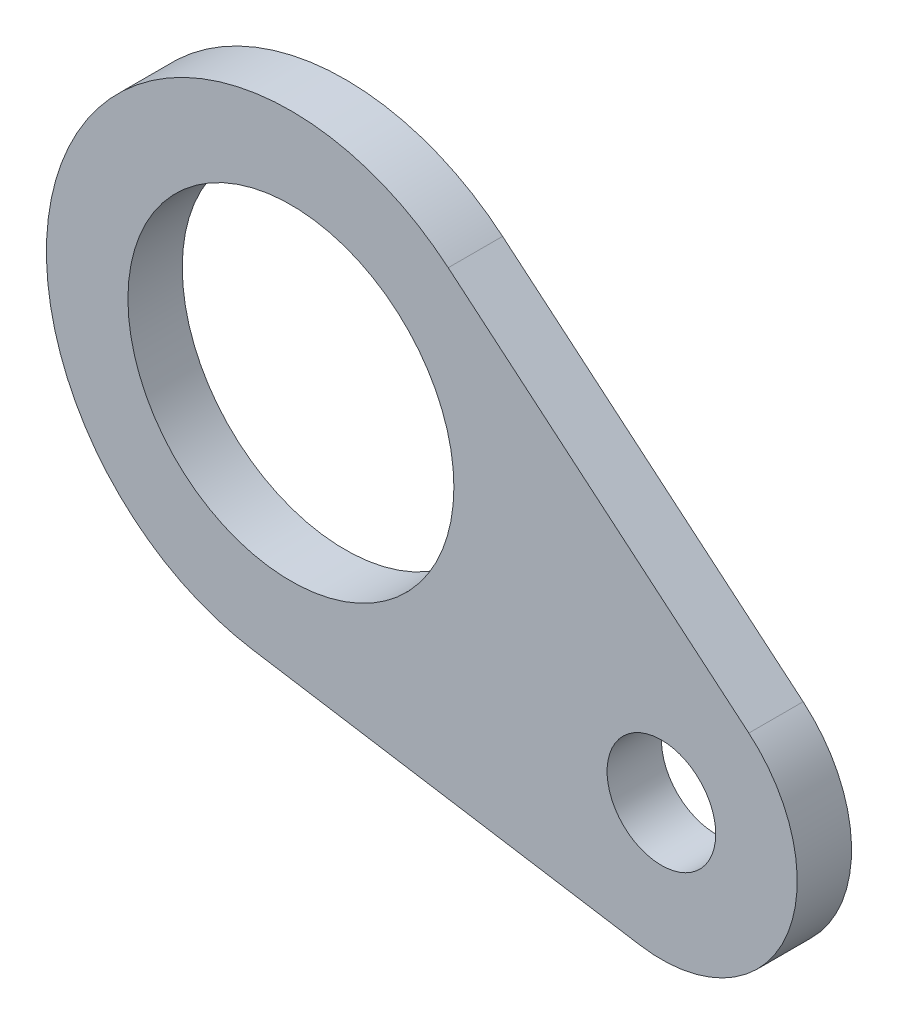
ISO-10303-21;
HEADER;
FILE_DESCRIPTION(('STEP AP214'),'2;1');
FILE_NAME('part.step','',(''),(''),'','','');
FILE_SCHEMA(('AUTOMOTIVE_DESIGN { 1 0 10303 214 1 1 1 1 }'));
ENDSEC;
DATA;
#1=APPLICATION_CONTEXT('core data for automotive mechanical design processes');
#2=APPLICATION_PROTOCOL_DEFINITION('international standard','automotive_design',2000,#1);
#3=PRODUCT_CONTEXT('',#1,'mechanical');
#4=PRODUCT('Part','Part','',(#3));
#5=PRODUCT_RELATED_PRODUCT_CATEGORY('part','',(#4));
#6=PRODUCT_DEFINITION_FORMATION('','',#4);
#7=PRODUCT_DEFINITION_CONTEXT('part definition',#1,'design');
#8=PRODUCT_DEFINITION('design','',#6,#7);
#9=PRODUCT_DEFINITION_SHAPE('','',#8);
#10=(LENGTH_UNIT() NAMED_UNIT(*) SI_UNIT(.MILLI.,.METRE.));
#11=(NAMED_UNIT(*) PLANE_ANGLE_UNIT() SI_UNIT($,.RADIAN.));
#12=(NAMED_UNIT(*) SI_UNIT($,.STERADIAN.) SOLID_ANGLE_UNIT());
#13=UNCERTAINTY_MEASURE_WITH_UNIT(LENGTH_MEASURE(1.E-05),#10,'distance_accuracy_value','');
#14=(GEOMETRIC_REPRESENTATION_CONTEXT(3) GLOBAL_UNCERTAINTY_ASSIGNED_CONTEXT((#13)) GLOBAL_UNIT_ASSIGNED_CONTEXT((#10,
#11,#12)) REPRESENTATION_CONTEXT('',''));
#15=CARTESIAN_POINT('',(0.,0.,0.));
#16=DIRECTION('',(0.,0.,1.));
#17=DIRECTION('',(1.,0.,0.));
#18=AXIS2_PLACEMENT_3D('',#15,#16,#17);
#19=CARTESIAN_POINT('',(-18.1262683767664,-21.5592093047159,1.));
#20=DIRECTION('',(0.643536155388157,0.765415714960328,0.));
#21=DIRECTION('',(-0.765415714960328,0.643536155388157,0.));
#22=AXIS2_PLACEMENT_3D('',#19,#20,#21);
#23=PLANE('',#22);
#24=DIRECTION('',(0.765415714960328,-0.643536155388157,0.));
#25=VECTOR('',#24,1.);
#26=CARTESIAN_POINT('',(-18.1262683767664,-21.5592093047159,0.));
#27=LINE('',#26,#25);
#28=CARTESIAN_POINT('',(-108.494409163824,54.4193272669992,0.));
#29=VERTEX_POINT('',#28);
#30=CARTESIAN_POINT('',(-102.961665850331,49.7675801299554,0.));
#31=VERTEX_POINT('',#30);
#32=EDGE_CURVE('E121',#29,#31,#27,.T.);
#33=ORIENTED_EDGE('',*,*,#32,.F.);
#34=DIRECTION('',(0.,0.,-1.));
#35=VECTOR('',#34,1.);
#36=CARTESIAN_POINT('',(-108.494409163824,54.4193272669992,1.));
#37=LINE('',#36,#35);
#38=CARTESIAN_POINT('',(-108.494409163824,54.4193272669992,1.));
#39=VERTEX_POINT('',#38);
#40=EDGE_CURVE('E11',#39,#29,#37,.T.);
#41=ORIENTED_EDGE('',*,*,#40,.F.);
#42=DIRECTION('',(0.765415714960328,-0.643536155388157,0.));
#43=VECTOR('',#42,1.);
#44=CARTESIAN_POINT('',(-18.1262683767664,-21.5592093047159,1.));
#45=LINE('',#44,#43);
#46=CARTESIAN_POINT('',(-102.961665850331,49.7675801299554,1.));
#47=VERTEX_POINT('',#46);
#48=EDGE_CURVE('E98',#39,#47,#45,.T.);
#49=ORIENTED_EDGE('',*,*,#48,.T.);
#50=DIRECTION('',(0.,0.,-1.));
#51=VECTOR('',#50,1.);
#52=CARTESIAN_POINT('',(-102.961665850331,49.7675801299554,1.));
#53=LINE('',#52,#51);
#54=EDGE_CURVE('E59',#47,#31,#53,.T.);
#55=ORIENTED_EDGE('',*,*,#54,.T.);
#56=EDGE_LOOP('',(#33,#41,#49,#55));
#57=FACE_BOUND('',#56,.T.);
#58=ADVANCED_FACE('F41',(#57),#23,.T.);
#59=CARTESIAN_POINT('',(-111.390321863071,50.9749565496777,1.));
#60=DIRECTION('',(0.,0.,-1.));
#61=DIRECTION('',(-1.,0.,0.));
#62=AXIS2_PLACEMENT_3D('',#59,#60,#61);
#63=CYLINDRICAL_SURFACE('',#62,4.49999999999999);
#64=CARTESIAN_POINT('',(-111.390321863071,50.9749565496777,0.));
#65=DIRECTION('',(0.,0.,1.));
#66=DIRECTION('',(1.,0.,0.));
#67=AXIS2_PLACEMENT_3D('',#64,#65,#66);
#68=CIRCLE('',#67,4.49999999999999);
#69=CARTESIAN_POINT('',(-112.103893562551,46.5318928060768,0.));
#70=VERTEX_POINT('',#69);
#71=EDGE_CURVE('E104',#29,#70,#68,.T.);
#72=ORIENTED_EDGE('',*,*,#71,.T.);
#73=DIRECTION('',(0.,0.,-1.));
#74=VECTOR('',#73,1.);
#75=CARTESIAN_POINT('',(-112.103893562551,46.5318928060768,1.));
#76=LINE('',#75,#74);
#77=CARTESIAN_POINT('',(-112.103893562551,46.5318928060768,1.));
#78=VERTEX_POINT('',#77);
#79=EDGE_CURVE('E51',#78,#70,#76,.T.);
#80=ORIENTED_EDGE('',*,*,#79,.F.);
#81=CARTESIAN_POINT('',(-111.390321863071,50.9749565496777,1.));
#82=DIRECTION('',(0.,0.,1.));
#83=DIRECTION('',(1.,0.,0.));
#84=AXIS2_PLACEMENT_3D('',#81,#82,#83);
#85=CIRCLE('',#84,4.49999999999999);
#86=EDGE_CURVE('E94',#39,#78,#85,.T.);
#87=ORIENTED_EDGE('',*,*,#86,.F.);
#88=ORIENTED_EDGE('',*,*,#40,.T.);
#89=EDGE_LOOP('',(#72,#80,#87,#88));
#90=FACE_BOUND('',#89,.T.);
#91=ADVANCED_FACE('F102',(#90),#63,.T.);
#92=CARTESIAN_POINT('',(4.46643026711821,27.8102878766129,1.));
#93=DIRECTION('',(0.158571488773428,0.987347498577972,0.));
#94=DIRECTION('',(-0.987347498577972,0.158571488773428,0.));
#95=AXIS2_PLACEMENT_3D('',#92,#93,#94);
#96=PLANE('',#95);
#97=DIRECTION('',(0.987347498577972,-0.158571488773428,0.));
#98=VECTOR('',#97,1.);
#99=CARTESIAN_POINT('',(4.46643026711821,27.8102878766129,0.));
#100=LINE('',#99,#98);
#101=CARTESIAN_POINT('',(-104.966934960735,45.3856720961096,0.));
#102=VERTEX_POINT('',#101);
#103=EDGE_CURVE('E116',#70,#102,#100,.T.);
#104=ORIENTED_EDGE('',*,*,#103,.T.);
#105=DIRECTION('',(0.,0.,-1.));
#106=VECTOR('',#105,1.);
#107=CARTESIAN_POINT('',(-104.966934960735,45.3856720961096,1.));
#108=LINE('',#107,#106);
#109=CARTESIAN_POINT('',(-104.966934960735,45.3856720961096,1.));
#110=VERTEX_POINT('',#109);
#111=EDGE_CURVE('E73',#110,#102,#108,.T.);
#112=ORIENTED_EDGE('',*,*,#111,.F.);
#113=DIRECTION('',(0.987347498577972,-0.158571488773428,0.));
#114=VECTOR('',#113,1.);
#115=CARTESIAN_POINT('',(4.46643026711821,27.8102878766129,1.));
#116=LINE('',#115,#114);
#117=EDGE_CURVE('E85',#78,#110,#116,.T.);
#118=ORIENTED_EDGE('',*,*,#117,.F.);
#119=ORIENTED_EDGE('',*,*,#79,.T.);
#120=EDGE_LOOP('',(#104,#112,#118,#119));
#121=FACE_BOUND('',#120,.T.);
#122=ADVANCED_FACE('F87',(#121),#96,.F.);
#123=CARTESIAN_POINT('',(-111.390321863071,50.9749565496777,1.));
#124=DIRECTION('',(0.,0.,-1.));
#125=DIRECTION('',(-1.,0.,0.));
#126=AXIS2_PLACEMENT_3D('',#123,#124,#125);
#127=CYLINDRICAL_SURFACE('',#126,3.00000000000001);
#128=CARTESIAN_POINT('',(-111.390321863071,50.9749565496777,1.));
#129=DIRECTION('',(0.,0.,1.));
#130=DIRECTION('',(1.,0.,0.));
#131=AXIS2_PLACEMENT_3D('',#128,#129,#130);
#132=CIRCLE('',#131,3.00000000000001);
#133=CARTESIAN_POINT('',(-108.390321863071,50.9749565496777,1.));
#134=VERTEX_POINT('',#133);
#135=EDGE_CURVE('E136',#134,#134,#132,.T.);
#136=ORIENTED_EDGE('',*,*,#135,.T.);
#137=EDGE_LOOP('',(#136));
#138=FACE_BOUND('',#137,.T.);
#139=CARTESIAN_POINT('',(-111.390321863071,50.9749565496777,0.));
#140=DIRECTION('',(0.,0.,1.));
#141=DIRECTION('',(1.,0.,0.));
#142=AXIS2_PLACEMENT_3D('',#139,#140,#141);
#143=CIRCLE('',#142,3.00000000000001);
#144=CARTESIAN_POINT('',(-108.390321863071,50.9749565496777,0.));
#145=VERTEX_POINT('',#144);
#146=EDGE_CURVE('E124',#145,#145,#143,.T.);
#147=ORIENTED_EDGE('',*,*,#146,.F.);
#148=EDGE_LOOP('',(#147));
#149=FACE_BOUND('',#148,.T.);
#150=ADVANCED_FACE('F153',(#138,#149),#127,.F.);
#151=CARTESIAN_POINT('',(-104.570506238801,47.8540408425545,1.));
#152=DIRECTION('',(0.,0.,-1.));
#153=DIRECTION('',(-1.,0.,0.));
#154=AXIS2_PLACEMENT_3D('',#151,#152,#153);
#155=CYLINDRICAL_SURFACE('',#154,0.999999999999998);
#156=CARTESIAN_POINT('',(-104.570506238801,47.8540408425545,1.));
#157=DIRECTION('',(0.,0.,1.));
#158=DIRECTION('',(1.,0.,0.));
#159=AXIS2_PLACEMENT_3D('',#156,#157,#158);
#160=CIRCLE('',#159,0.999999999999998);
#161=CARTESIAN_POINT('',(-103.570506238801,47.8540408425545,1.));
#162=VERTEX_POINT('',#161);
#163=EDGE_CURVE('E115',#162,#162,#160,.T.);
#164=ORIENTED_EDGE('',*,*,#163,.T.);
#165=EDGE_LOOP('',(#164));
#166=FACE_BOUND('',#165,.T.);
#167=CARTESIAN_POINT('',(-104.570506238801,47.8540408425545,0.));
#168=DIRECTION('',(0.,0.,1.));
#169=DIRECTION('',(1.,0.,0.));
#170=AXIS2_PLACEMENT_3D('',#167,#168,#169);
#171=CIRCLE('',#170,0.999999999999998);
#172=CARTESIAN_POINT('',(-103.570506238801,47.8540408425545,0.));
#173=VERTEX_POINT('',#172);
#174=EDGE_CURVE('E128',#173,#173,#171,.T.);
#175=ORIENTED_EDGE('',*,*,#174,.F.);
#176=EDGE_LOOP('',(#175));
#177=FACE_BOUND('',#176,.T.);
#178=ADVANCED_FACE('F43',(#166,#177),#155,.F.);
#179=CARTESIAN_POINT('',(-104.570506238801,47.8540408425545,1.));
#180=DIRECTION('',(0.,0.,-1.));
#181=DIRECTION('',(-1.,0.,0.));
#182=AXIS2_PLACEMENT_3D('',#179,#180,#181);
#183=CYLINDRICAL_SURFACE('',#182,2.49999999999999);
#184=CARTESIAN_POINT('',(-104.570506238801,47.8540408425545,0.));
#185=DIRECTION('',(0.,0.,1.));
#186=DIRECTION('',(1.,0.,0.));
#187=AXIS2_PLACEMENT_3D('',#184,#185,#186);
#188=CIRCLE('',#187,2.49999999999999);
#189=EDGE_CURVE('E111',#31,#102,#188,.F.);
#190=ORIENTED_EDGE('',*,*,#189,.F.);
#191=ORIENTED_EDGE('',*,*,#54,.F.);
#192=CARTESIAN_POINT('',(-104.570506238801,47.8540408425545,1.));
#193=DIRECTION('',(0.,0.,1.));
#194=DIRECTION('',(1.,0.,0.));
#195=AXIS2_PLACEMENT_3D('',#192,#193,#194);
#196=CIRCLE('',#195,2.49999999999999);
#197=EDGE_CURVE('E93',#47,#110,#196,.F.);
#198=ORIENTED_EDGE('',*,*,#197,.T.);
#199=ORIENTED_EDGE('',*,*,#111,.T.);
#200=EDGE_LOOP('',(#190,#191,#198,#199));
#201=FACE_BOUND('',#200,.T.);
#202=ADVANCED_FACE('F149',(#201),#183,.T.);
#203=CARTESIAN_POINT('',(0.,0.,1.));
#204=DIRECTION('',(0.,0.,1.));
#205=DIRECTION('',(1.,0.,0.));
#206=AXIS2_PLACEMENT_3D('',#203,#204,#205);
#207=PLANE('',#206);
#208=ORIENTED_EDGE('',*,*,#163,.F.);
#209=EDGE_LOOP('',(#208));
#210=FACE_BOUND('',#209,.T.);
#211=ORIENTED_EDGE('',*,*,#135,.F.);
#212=EDGE_LOOP('',(#211));
#213=FACE_BOUND('',#212,.T.);
#214=ORIENTED_EDGE('',*,*,#48,.F.);
#215=ORIENTED_EDGE('',*,*,#86,.T.);
#216=ORIENTED_EDGE('',*,*,#117,.T.);
#217=ORIENTED_EDGE('',*,*,#197,.F.);
#218=EDGE_LOOP('',(#214,#215,#216,#217));
#219=FACE_BOUND('',#218,.T.);
#220=ADVANCED_FACE('F97',(#210,#213,#219),#207,.T.);
#221=CARTESIAN_POINT('',(0.,0.,0.));
#222=DIRECTION('',(0.,0.,1.));
#223=DIRECTION('',(1.,0.,0.));
#224=AXIS2_PLACEMENT_3D('',#221,#222,#223);
#225=PLANE('',#224);
#226=ORIENTED_EDGE('',*,*,#174,.T.);
#227=EDGE_LOOP('',(#226));
#228=FACE_BOUND('',#227,.T.);
#229=ORIENTED_EDGE('',*,*,#146,.T.);
#230=EDGE_LOOP('',(#229));
#231=FACE_BOUND('',#230,.T.);
#232=ORIENTED_EDGE('',*,*,#32,.T.);
#233=ORIENTED_EDGE('',*,*,#189,.T.);
#234=ORIENTED_EDGE('',*,*,#103,.F.);
#235=ORIENTED_EDGE('',*,*,#71,.F.);
#236=EDGE_LOOP('',(#232,#233,#234,#235));
#237=FACE_BOUND('',#236,.T.);
#238=ADVANCED_FACE('F148',(#228,#231,#237),#225,.F.);
#239=CLOSED_SHELL('',(#58,#91,#122,#150,#178,#202,#220,#238));
#240=MANIFOLD_SOLID_BREP('B2',#239);
#241=ADVANCED_BREP_SHAPE_REPRESENTATION('',(#18,#240),#14);
#242=SHAPE_DEFINITION_REPRESENTATION(#9,#241);
ENDSEC;
END-ISO-10303-21;
